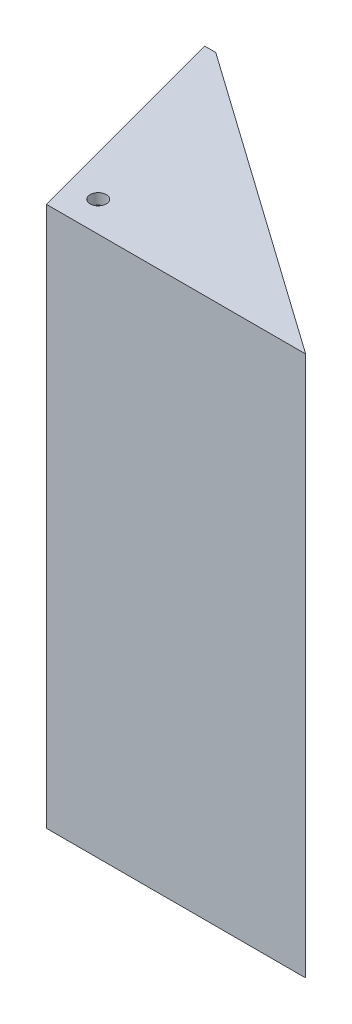
ISO-10303-21;
HEADER;
FILE_DESCRIPTION(('STEP AP214'),'2;1');
FILE_NAME('part.step','',(''),(''),'','','');
FILE_SCHEMA(('AUTOMOTIVE_DESIGN { 1 0 10303 214 1 1 1 1 }'));
ENDSEC;
DATA;
#1=APPLICATION_CONTEXT('core data for automotive mechanical design processes');
#2=APPLICATION_PROTOCOL_DEFINITION('international standard','automotive_design',2000,#1);
#3=PRODUCT_CONTEXT('',#1,'mechanical');
#4=PRODUCT('Part','Part','',(#3));
#5=PRODUCT_RELATED_PRODUCT_CATEGORY('part','',(#4));
#6=PRODUCT_DEFINITION_FORMATION('','',#4);
#7=PRODUCT_DEFINITION_CONTEXT('part definition',#1,'design');
#8=PRODUCT_DEFINITION('design','',#6,#7);
#9=PRODUCT_DEFINITION_SHAPE('','',#8);
#10=(LENGTH_UNIT() NAMED_UNIT(*) SI_UNIT(.MILLI.,.METRE.));
#11=(NAMED_UNIT(*) PLANE_ANGLE_UNIT() SI_UNIT($,.RADIAN.));
#12=(NAMED_UNIT(*) SI_UNIT($,.STERADIAN.) SOLID_ANGLE_UNIT());
#13=UNCERTAINTY_MEASURE_WITH_UNIT(LENGTH_MEASURE(1.E-05),#10,'distance_accuracy_value','');
#14=(GEOMETRIC_REPRESENTATION_CONTEXT(3) GLOBAL_UNCERTAINTY_ASSIGNED_CONTEXT((#13)) GLOBAL_UNIT_ASSIGNED_CONTEXT((#10,
#11,#12)) REPRESENTATION_CONTEXT('',''));
#15=CARTESIAN_POINT('',(0.,0.,0.));
#16=DIRECTION('',(0.,0.,1.));
#17=DIRECTION('',(1.,0.,0.));
#18=AXIS2_PLACEMENT_3D('',#15,#16,#17);
#19=CARTESIAN_POINT('',(0.,3.175,0.));
#20=DIRECTION('',(0.,-1.,0.));
#21=DIRECTION('',(0.,0.,-1.));
#22=AXIS2_PLACEMENT_3D('',#19,#20,#21);
#23=PLANE('',#22);
#24=CARTESIAN_POINT('',(6.35000000000001,3.17500000000001,-8.89));
#25=DIRECTION('',(0.,-1.,0.));
#26=DIRECTION('',(0.,0.,-1.));
#27=AXIS2_PLACEMENT_3D('',#24,#25,#26);
#28=CIRCLE('',#27,2.38125);
#29=CARTESIAN_POINT('',(6.35000000000001,3.17500000000001,-11.27125));
#30=VERTEX_POINT('',#29);
#31=EDGE_CURVE('E128',#30,#30,#28,.T.);
#32=ORIENTED_EDGE('',*,*,#31,.T.);
#33=EDGE_LOOP('',(#32));
#34=FACE_BOUND('',#33,.T.);
#35=DIRECTION('',(-0.965925826289068,0.,-0.258819045102522));
#36=VECTOR('',#35,1.);
#37=CARTESIAN_POINT('',(5.10443211581293,3.175,-19.0500000000001));
#38=LINE('',#37,#36);
#39=CARTESIAN_POINT('',(64.3507386859689,3.175,-3.17499999999999));
#40=VERTEX_POINT('',#39);
#41=CARTESIAN_POINT('',(76.2,3.17500000000001,0.));
#42=VERTEX_POINT('',#41);
#43=EDGE_CURVE('E49',#40,#42,#38,.F.);
#44=ORIENTED_EDGE('',*,*,#43,.T.);
#45=DIRECTION('',(-0.816875529536207,0.,-0.57681398149225));
#46=VECTOR('',#45,1.);
#47=CARTESIAN_POINT('',(25.3528349364646,3.175,-35.9043142650432));
#48=LINE('',#47,#46);
#49=CARTESIAN_POINT('',(-13.7277718465741,3.17500000000001,-63.5));
#50=VERTEX_POINT('',#49);
#51=EDGE_CURVE('E174',#42,#50,#48,.T.);
#52=ORIENTED_EDGE('',*,*,#51,.T.);
#53=DIRECTION('',(-0.258819045102518,0.,-0.965925826289069));
#54=VECTOR('',#53,1.);
#55=CARTESIAN_POINT('',(2.43626318683323,3.175,-3.17499999999999));
#56=LINE('',#55,#54);
#57=CARTESIAN_POINT('',(2.43626318683323,3.175,-3.17499999999999));
#58=VERTEX_POINT('',#57);
#59=EDGE_CURVE('E140',#58,#50,#56,.T.);
#60=ORIENTED_EDGE('',*,*,#59,.F.);
#61=DIRECTION('',(-1.,0.,0.));
#62=VECTOR('',#61,1.);
#63=CARTESIAN_POINT('',(76.2,3.175,-3.175));
#64=LINE('',#63,#62);
#65=EDGE_CURVE('E136',#40,#58,#64,.T.);
#66=ORIENTED_EDGE('',*,*,#65,.F.);
#67=EDGE_LOOP('',(#44,#52,#60,#66));
#68=FACE_BOUND('',#67,.T.);
#69=ADVANCED_FACE('F39',(#34,#68),#23,.F.);
#70=CARTESIAN_POINT('',(76.2,3.175,-63.5));
#71=DIRECTION('',(0.,0.,1.));
#72=DIRECTION('',(1.,0.,0.));
#73=AXIS2_PLACEMENT_3D('',#70,#71,#72);
#74=PLANE('',#73);
#75=DIRECTION('',(-1.,0.,0.));
#76=VECTOR('',#75,1.);
#77=CARTESIAN_POINT('',(76.2,158.75,-63.5));
#78=LINE('',#77,#76);
#79=CARTESIAN_POINT('',(-13.7277718465741,158.75,-63.5));
#80=VERTEX_POINT('',#79);
#81=CARTESIAN_POINT('',(-17.0147737193762,158.75,-63.5));
#82=VERTEX_POINT('',#81);
#83=EDGE_CURVE('E117',#80,#82,#78,.T.);
#84=ORIENTED_EDGE('',*,*,#83,.F.);
#85=DIRECTION('',(0.,1.,0.));
#86=VECTOR('',#85,1.);
#87=CARTESIAN_POINT('',(-13.7277718465741,-95.25,-63.5));
#88=LINE('',#87,#86);
#89=CARTESIAN_POINT('',(-13.7277718465741,155.575,-63.5));
#90=VERTEX_POINT('',#89);
#91=EDGE_CURVE('E102',#90,#80,#88,.T.);
#92=ORIENTED_EDGE('',*,*,#91,.F.);
#93=DIRECTION('',(0.,-1.,0.));
#94=VECTOR('',#93,1.);
#95=CARTESIAN_POINT('',(-13.7277718465741,155.575,-63.5));
#96=LINE('',#95,#94);
#97=EDGE_CURVE('E143',#90,#50,#96,.T.);
#98=ORIENTED_EDGE('',*,*,#97,.T.);
#99=CARTESIAN_POINT('',(-13.7277718465741,0.,-63.5));
#100=VERTEX_POINT('',#99);
#101=EDGE_CURVE('E111',#100,#50,#88,.T.);
#102=ORIENTED_EDGE('',*,*,#101,.F.);
#103=DIRECTION('',(-1.,0.,0.));
#104=VECTOR('',#103,1.);
#105=CARTESIAN_POINT('',(76.2,0.,-63.5));
#106=LINE('',#105,#104);
#107=CARTESIAN_POINT('',(-17.0147737193762,0.,-63.5));
#108=VERTEX_POINT('',#107);
#109=EDGE_CURVE('E151',#100,#108,#106,.T.);
#110=ORIENTED_EDGE('',*,*,#109,.T.);
#111=DIRECTION('',(0.,-1.,0.));
#112=VECTOR('',#111,1.);
#113=CARTESIAN_POINT('',(-17.0147737193762,3.175,-63.5));
#114=LINE('',#113,#112);
#115=EDGE_CURVE('E125',#82,#108,#114,.T.);
#116=ORIENTED_EDGE('',*,*,#115,.F.);
#117=EDGE_LOOP('',(#84,#92,#98,#102,#110,#116));
#118=FACE_BOUND('',#117,.T.);
#119=ADVANCED_FACE('F123',(#118),#74,.F.);
#120=CARTESIAN_POINT('',(-17.0147737193762,3.175,-63.5));
#121=DIRECTION('',(0.965925826289069,0.,-0.258819045102519));
#122=DIRECTION('',(-0.258819045102519,0.,-0.965925826289069));
#123=AXIS2_PLACEMENT_3D('',#120,#121,#122);
#124=PLANE('',#123);
#125=CARTESIAN_POINT('',(-15.8084857832013,38.1,-58.9980721336381));
#126=DIRECTION('',(0.965925826289069,0.,-0.258819045102519));
#127=DIRECTION('',(-0.258819045102519,0.,-0.965925826289069));
#128=AXIS2_PLACEMENT_3D('',#125,#126,#127);
#129=CIRCLE('',#128,1.58749999999999);
#130=CARTESIAN_POINT('',(-16.2193610173016,38.1,-60.531479382872));
#131=VERTEX_POINT('',#130);
#132=EDGE_CURVE('E121',#131,#131,#129,.T.);
#133=ORIENTED_EDGE('',*,*,#132,.T.);
#134=EDGE_LOOP('',(#133));
#135=FACE_BOUND('',#134,.T.);
#136=DIRECTION('',(0.258819045102519,0.,0.965925826289069));
#137=VECTOR('',#136,1.);
#138=CARTESIAN_POINT('',(-17.0147737193762,0.,-63.5));
#139=LINE('',#138,#137);
#140=CARTESIAN_POINT('',(0.,0.,0.));
#141=VERTEX_POINT('',#140);
#142=EDGE_CURVE('E153',#108,#141,#139,.T.);
#143=ORIENTED_EDGE('',*,*,#142,.T.);
#144=DIRECTION('',(0.,-1.,0.));
#145=VECTOR('',#144,1.);
#146=CARTESIAN_POINT('',(0.,3.175,0.));
#147=LINE('',#146,#145);
#148=CARTESIAN_POINT('',(0.,158.75,0.));
#149=VERTEX_POINT('',#148);
#150=EDGE_CURVE('E160',#149,#141,#147,.T.);
#151=ORIENTED_EDGE('',*,*,#150,.F.);
#152=DIRECTION('',(0.258819045102519,0.,0.965925826289069));
#153=VECTOR('',#152,1.);
#154=CARTESIAN_POINT('',(-17.0147737193762,158.75,-63.5));
#155=LINE('',#154,#153);
#156=EDGE_CURVE('E127',#82,#149,#155,.T.);
#157=ORIENTED_EDGE('',*,*,#156,.F.);
#158=ORIENTED_EDGE('',*,*,#115,.T.);
#159=EDGE_LOOP('',(#143,#151,#157,#158));
#160=FACE_BOUND('',#159,.T.);
#161=ADVANCED_FACE('F200',(#135,#160),#124,.F.);
#162=CARTESIAN_POINT('',(0.,3.175,0.));
#163=DIRECTION('',(0.,0.,-1.));
#164=DIRECTION('',(-1.,0.,0.));
#165=AXIS2_PLACEMENT_3D('',#162,#163,#164);
#166=PLANE('',#165);
#167=DIRECTION('',(1.,0.,0.));
#168=VECTOR('',#167,1.);
#169=CARTESIAN_POINT('',(0.,0.,0.));
#170=LINE('',#169,#168);
#171=CARTESIAN_POINT('',(76.2,0.,0.));
#172=VERTEX_POINT('',#171);
#173=EDGE_CURVE('E155',#141,#172,#170,.T.);
#174=ORIENTED_EDGE('',*,*,#173,.T.);
#175=DIRECTION('',(0.,-1.,0.));
#176=VECTOR('',#175,1.);
#177=CARTESIAN_POINT('',(76.2,3.175,0.));
#178=LINE('',#177,#176);
#179=EDGE_CURVE('E158',#42,#172,#178,.T.);
#180=ORIENTED_EDGE('',*,*,#179,.F.);
#181=CARTESIAN_POINT('',(76.2,155.575,0.));
#182=VERTEX_POINT('',#181);
#183=EDGE_CURVE('E161',#182,#42,#178,.T.);
#184=ORIENTED_EDGE('',*,*,#183,.F.);
#185=CARTESIAN_POINT('',(76.2,158.75,0.));
#186=VERTEX_POINT('',#185);
#187=EDGE_CURVE('E56',#186,#182,#178,.T.);
#188=ORIENTED_EDGE('',*,*,#187,.F.);
#189=DIRECTION('',(1.,0.,0.));
#190=VECTOR('',#189,1.);
#191=CARTESIAN_POINT('',(0.,158.75,0.));
#192=LINE('',#191,#190);
#193=EDGE_CURVE('E120',#149,#186,#192,.T.);
#194=ORIENTED_EDGE('',*,*,#193,.F.);
#195=ORIENTED_EDGE('',*,*,#150,.T.);
#196=EDGE_LOOP('',(#174,#180,#184,#188,#194,#195));
#197=FACE_BOUND('',#196,.T.);
#198=ADVANCED_FACE('F180',(#197),#166,.F.);
#199=CARTESIAN_POINT('',(0.,0.,0.));
#200=DIRECTION('',(0.,-1.,0.));
#201=DIRECTION('',(0.,0.,-1.));
#202=AXIS2_PLACEMENT_3D('',#199,#200,#201);
#203=PLANE('',#202);
#204=DIRECTION('',(-0.816875529536207,0.,-0.57681398149225));
#205=VECTOR('',#204,1.);
#206=CARTESIAN_POINT('',(25.3528349364646,0.,-35.9043142650432));
#207=LINE('',#206,#205);
#208=EDGE_CURVE('E198',#172,#100,#207,.T.);
#209=ORIENTED_EDGE('',*,*,#208,.F.);
#210=ORIENTED_EDGE('',*,*,#173,.F.);
#211=ORIENTED_EDGE('',*,*,#142,.F.);
#212=ORIENTED_EDGE('',*,*,#109,.F.);
#213=EDGE_LOOP('',(#209,#210,#211,#212));
#214=FACE_BOUND('',#213,.T.);
#215=CARTESIAN_POINT('',(6.35000000000001,0.,-8.89));
#216=DIRECTION('',(0.,-1.,0.));
#217=DIRECTION('',(0.,0.,-1.));
#218=AXIS2_PLACEMENT_3D('',#215,#216,#217);
#219=CIRCLE('',#218,2.38125);
#220=CARTESIAN_POINT('',(6.35000000000001,0.,-11.27125));
#221=VERTEX_POINT('',#220);
#222=EDGE_CURVE('E259',#221,#221,#219,.T.);
#223=ORIENTED_EDGE('',*,*,#222,.F.);
#224=EDGE_LOOP('',(#223));
#225=FACE_BOUND('',#224,.T.);
#226=ADVANCED_FACE('F196',(#214,#225),#203,.T.);
#227=CARTESIAN_POINT('',(76.2,155.575,-3.175));
#228=DIRECTION('',(0.,0.,1.));
#229=DIRECTION('',(1.,0.,0.));
#230=AXIS2_PLACEMENT_3D('',#227,#228,#229);
#231=PLANE('',#230);
#232=DIRECTION('',(-1.,0.,0.));
#233=VECTOR('',#232,1.);
#234=CARTESIAN_POINT('',(76.2,155.575,-3.175));
#235=LINE('',#234,#233);
#236=CARTESIAN_POINT('',(64.3507386859689,155.575,-3.17499999999999));
#237=VERTEX_POINT('',#236);
#238=CARTESIAN_POINT('',(2.43626318683323,155.575,-3.17499999999999));
#239=VERTEX_POINT('',#238);
#240=EDGE_CURVE('E137',#237,#239,#235,.T.);
#241=ORIENTED_EDGE('',*,*,#240,.F.);
#242=DIRECTION('',(0.,-1.,0.));
#243=VECTOR('',#242,1.);
#244=CARTESIAN_POINT('',(64.3507386859689,155.575,-3.17499999999999));
#245=LINE('',#244,#243);
#246=EDGE_CURVE('E165',#237,#40,#245,.T.);
#247=ORIENTED_EDGE('',*,*,#246,.T.);
#248=ORIENTED_EDGE('',*,*,#65,.T.);
#249=DIRECTION('',(0.,-1.,0.));
#250=VECTOR('',#249,1.);
#251=CARTESIAN_POINT('',(2.43626318683323,155.575,-3.17499999999999));
#252=LINE('',#251,#250);
#253=EDGE_CURVE('E148',#239,#58,#252,.T.);
#254=ORIENTED_EDGE('',*,*,#253,.F.);
#255=EDGE_LOOP('',(#241,#247,#248,#254));
#256=FACE_BOUND('',#255,.T.);
#257=ADVANCED_FACE('F185',(#256),#231,.F.);
#258=CARTESIAN_POINT('',(2.43626318683323,155.575,-3.17499999999999));
#259=DIRECTION('',(-0.965925826289069,0.,0.258819045102518));
#260=DIRECTION('',(0.258819045102518,0.,0.965925826289069));
#261=AXIS2_PLACEMENT_3D('',#258,#259,#260);
#262=PLANE('',#261);
#263=CARTESIAN_POINT('',(-12.7416712847335,38.1,-59.8198226018387));
#264=DIRECTION('',(0.965925826289069,0.,-0.258819045102518));
#265=DIRECTION('',(-0.258819045102518,0.,-0.965925826289069));
#266=AXIS2_PLACEMENT_3D('',#263,#264,#265);
#267=CIRCLE('',#266,1.58749999999999);
#268=CARTESIAN_POINT('',(-13.1525465188337,38.1,-61.3532298510725));
#269=VERTEX_POINT('',#268);
#270=EDGE_CURVE('E251',#269,#269,#267,.T.);
#271=ORIENTED_EDGE('',*,*,#270,.F.);
#272=EDGE_LOOP('',(#271));
#273=FACE_BOUND('',#272,.T.);
#274=ORIENTED_EDGE('',*,*,#59,.T.);
#275=ORIENTED_EDGE('',*,*,#97,.F.);
#276=DIRECTION('',(-0.258819045102518,0.,-0.965925826289069));
#277=VECTOR('',#276,1.);
#278=CARTESIAN_POINT('',(2.43626318683323,155.575,-3.17499999999999));
#279=LINE('',#278,#277);
#280=EDGE_CURVE('E139',#239,#90,#279,.T.);
#281=ORIENTED_EDGE('',*,*,#280,.F.);
#282=ORIENTED_EDGE('',*,*,#253,.T.);
#283=EDGE_LOOP('',(#274,#275,#281,#282));
#284=FACE_BOUND('',#283,.T.);
#285=ADVANCED_FACE('F191',(#273,#284),#262,.F.);
#286=CARTESIAN_POINT('',(0.,158.75,0.));
#287=DIRECTION('',(0.,-1.,0.));
#288=DIRECTION('',(0.,0.,-1.));
#289=AXIS2_PLACEMENT_3D('',#286,#287,#288);
#290=PLANE('',#289);
#291=CARTESIAN_POINT('',(6.35000000000001,158.75,-8.89));
#292=DIRECTION('',(0.,-1.,0.));
#293=DIRECTION('',(0.,0.,-1.));
#294=AXIS2_PLACEMENT_3D('',#291,#292,#293);
#295=CIRCLE('',#294,2.38125);
#296=CARTESIAN_POINT('',(6.35000000000001,158.75,-11.27125));
#297=VERTEX_POINT('',#296);
#298=EDGE_CURVE('E260',#297,#297,#295,.T.);
#299=ORIENTED_EDGE('',*,*,#298,.T.);
#300=EDGE_LOOP('',(#299));
#301=FACE_BOUND('',#300,.T.);
#302=ORIENTED_EDGE('',*,*,#193,.T.);
#303=DIRECTION('',(0.816875529536207,0.,0.57681398149225));
#304=VECTOR('',#303,1.);
#305=CARTESIAN_POINT('',(-13.7277718465741,158.75,-63.5));
#306=LINE('',#305,#304);
#307=EDGE_CURVE('E105',#80,#186,#306,.T.);
#308=ORIENTED_EDGE('',*,*,#307,.F.);
#309=ORIENTED_EDGE('',*,*,#83,.T.);
#310=ORIENTED_EDGE('',*,*,#156,.T.);
#311=EDGE_LOOP('',(#302,#308,#309,#310));
#312=FACE_BOUND('',#311,.T.);
#313=ADVANCED_FACE('F115',(#301,#312),#290,.F.);
#314=CARTESIAN_POINT('',(0.,155.575,0.));
#315=DIRECTION('',(0.,-1.,0.));
#316=DIRECTION('',(0.,0.,-1.));
#317=AXIS2_PLACEMENT_3D('',#314,#315,#316);
#318=PLANE('',#317);
#319=DIRECTION('',(-0.816875529536207,0.,-0.57681398149225));
#320=VECTOR('',#319,1.);
#321=CARTESIAN_POINT('',(25.3528349364646,155.575,-35.9043142650432));
#322=LINE('',#321,#320);
#323=EDGE_CURVE('E106',#182,#90,#322,.T.);
#324=ORIENTED_EDGE('',*,*,#323,.F.);
#325=DIRECTION('',(0.965925826289068,0.,0.258819045102522));
#326=VECTOR('',#325,1.);
#327=CARTESIAN_POINT('',(64.3507386859689,155.575,-3.17499999999999));
#328=LINE('',#327,#326);
#329=EDGE_CURVE('E11',#182,#237,#328,.F.);
#330=ORIENTED_EDGE('',*,*,#329,.T.);
#331=ORIENTED_EDGE('',*,*,#240,.T.);
#332=ORIENTED_EDGE('',*,*,#280,.T.);
#333=EDGE_LOOP('',(#324,#330,#331,#332));
#334=FACE_BOUND('',#333,.T.);
#335=CARTESIAN_POINT('',(6.35000000000001,155.575,-8.89));
#336=DIRECTION('',(0.,-1.,0.));
#337=DIRECTION('',(0.,0.,-1.));
#338=AXIS2_PLACEMENT_3D('',#335,#336,#337);
#339=CIRCLE('',#338,2.38125);
#340=CARTESIAN_POINT('',(6.35000000000001,155.575,-11.27125));
#341=VERTEX_POINT('',#340);
#342=EDGE_CURVE('E44',#341,#341,#339,.T.);
#343=ORIENTED_EDGE('',*,*,#342,.F.);
#344=EDGE_LOOP('',(#343));
#345=FACE_BOUND('',#344,.T.);
#346=ADVANCED_FACE('F188',(#334,#345),#318,.T.);
#347=CARTESIAN_POINT('',(64.3507386859689,155.575,-3.17499999999999));
#348=DIRECTION('',(-0.258819045102522,0.,0.965925826289068));
#349=DIRECTION('',(0.,-1.,0.));
#350=AXIS2_PLACEMENT_3D('',#347,#348,#349);
#351=PLANE('',#350);
#352=ORIENTED_EDGE('',*,*,#329,.F.);
#353=ORIENTED_EDGE('',*,*,#183,.T.);
#354=ORIENTED_EDGE('',*,*,#43,.F.);
#355=ORIENTED_EDGE('',*,*,#246,.F.);
#356=EDGE_LOOP('',(#352,#353,#354,#355));
#357=FACE_BOUND('',#356,.T.);
#358=ADVANCED_FACE('F42',(#357),#351,.F.);
#359=CARTESIAN_POINT('',(6.35000000000001,158.75,-8.89));
#360=DIRECTION('',(0.,-1.,0.));
#361=DIRECTION('',(0.,0.,-1.));
#362=AXIS2_PLACEMENT_3D('',#359,#360,#361);
#363=CYLINDRICAL_SURFACE('',#362,2.38125);
#364=CARTESIAN_POINT('',(6.35000000000001,155.575,-11.27125));
#365=CARTESIAN_POINT('',(6.35000000000001,155.608072916667,-11.27125));
#366=CARTESIAN_POINT('',(6.35000000000001,155.641145833333,-11.27125));
#367=CARTESIAN_POINT('',(6.35000000000001,155.707291666667,-11.27125));
#368=CARTESIAN_POINT('',(6.35000000000001,155.740364583333,-11.27125));
#369=CARTESIAN_POINT('',(6.35000000000001,155.806510416667,-11.27125));
#370=CARTESIAN_POINT('',(6.35000000000001,155.839583333333,-11.27125));
#371=CARTESIAN_POINT('',(6.35000000000001,155.905729166667,-11.27125));
#372=CARTESIAN_POINT('',(6.35000000000001,155.938802083333,-11.27125));
#373=CARTESIAN_POINT('',(6.35000000000001,156.004947916667,-11.27125));
#374=CARTESIAN_POINT('',(6.35000000000001,156.038020833333,-11.27125));
#375=CARTESIAN_POINT('',(6.35000000000001,156.104166666667,-11.27125));
#376=CARTESIAN_POINT('',(6.35000000000001,156.137239583333,-11.27125));
#377=CARTESIAN_POINT('',(6.35000000000001,156.203385416667,-11.27125));
#378=CARTESIAN_POINT('',(6.35000000000001,156.236458333333,-11.27125));
#379=CARTESIAN_POINT('',(6.35000000000001,156.302604166667,-11.27125));
#380=CARTESIAN_POINT('',(6.35000000000001,156.335677083333,-11.27125));
#381=CARTESIAN_POINT('',(6.35000000000001,156.401822916667,-11.27125));
#382=CARTESIAN_POINT('',(6.35000000000001,156.434895833333,-11.27125));
#383=CARTESIAN_POINT('',(6.35000000000001,156.501041666667,-11.27125));
#384=CARTESIAN_POINT('',(6.35000000000001,156.534114583333,-11.27125));
#385=CARTESIAN_POINT('',(6.35000000000001,156.600260416667,-11.27125));
#386=CARTESIAN_POINT('',(6.35000000000001,156.633333333333,-11.27125));
#387=CARTESIAN_POINT('',(6.35000000000001,156.699479166667,-11.27125));
#388=CARTESIAN_POINT('',(6.35000000000001,156.732552083333,-11.27125));
#389=CARTESIAN_POINT('',(6.35000000000001,156.798697916667,-11.27125));
#390=CARTESIAN_POINT('',(6.35000000000001,156.831770833333,-11.27125));
#391=CARTESIAN_POINT('',(6.35000000000001,156.897916666667,-11.27125));
#392=CARTESIAN_POINT('',(6.35000000000001,156.930989583333,-11.27125));
#393=CARTESIAN_POINT('',(6.35000000000001,156.997135416667,-11.27125));
#394=CARTESIAN_POINT('',(6.35000000000001,157.030208333333,-11.27125));
#395=CARTESIAN_POINT('',(6.35000000000001,157.096354166667,-11.27125));
#396=CARTESIAN_POINT('',(6.35000000000001,157.129427083333,-11.27125));
#397=CARTESIAN_POINT('',(6.35000000000001,157.195572916667,-11.27125));
#398=CARTESIAN_POINT('',(6.35000000000001,157.228645833333,-11.27125));
#399=CARTESIAN_POINT('',(6.35000000000001,157.294791666667,-11.27125));
#400=CARTESIAN_POINT('',(6.35000000000001,157.327864583333,-11.27125));
#401=CARTESIAN_POINT('',(6.35000000000001,157.394010416667,-11.27125));
#402=CARTESIAN_POINT('',(6.35000000000001,157.427083333333,-11.27125));
#403=CARTESIAN_POINT('',(6.35000000000001,157.493229166667,-11.27125));
#404=CARTESIAN_POINT('',(6.35000000000001,157.526302083333,-11.27125));
#405=CARTESIAN_POINT('',(6.35000000000001,157.592447916667,-11.27125));
#406=CARTESIAN_POINT('',(6.35000000000001,157.625520833333,-11.27125));
#407=CARTESIAN_POINT('',(6.35000000000001,157.691666666667,-11.27125));
#408=CARTESIAN_POINT('',(6.35000000000001,157.724739583333,-11.27125));
#409=CARTESIAN_POINT('',(6.35000000000001,157.790885416667,-11.27125));
#410=CARTESIAN_POINT('',(6.35000000000001,157.823958333333,-11.27125));
#411=CARTESIAN_POINT('',(6.35000000000001,157.890104166667,-11.27125));
#412=CARTESIAN_POINT('',(6.35000000000001,157.923177083333,-11.27125));
#413=CARTESIAN_POINT('',(6.35000000000001,157.989322916667,-11.27125));
#414=CARTESIAN_POINT('',(6.35000000000001,158.022395833333,-11.27125));
#415=CARTESIAN_POINT('',(6.35000000000001,158.088541666667,-11.27125));
#416=CARTESIAN_POINT('',(6.35000000000001,158.121614583333,-11.27125));
#417=CARTESIAN_POINT('',(6.35000000000001,158.187760416667,-11.27125));
#418=CARTESIAN_POINT('',(6.35000000000001,158.220833333333,-11.27125));
#419=CARTESIAN_POINT('',(6.35000000000001,158.286979166667,-11.27125));
#420=CARTESIAN_POINT('',(6.35000000000001,158.320052083333,-11.27125));
#421=CARTESIAN_POINT('',(6.35000000000001,158.386197916667,-11.27125));
#422=CARTESIAN_POINT('',(6.35000000000001,158.419270833333,-11.27125));
#423=CARTESIAN_POINT('',(6.35000000000001,158.485416666667,-11.27125));
#424=CARTESIAN_POINT('',(6.35000000000001,158.518489583333,-11.27125));
#425=CARTESIAN_POINT('',(6.35000000000001,158.584635416667,-11.27125));
#426=CARTESIAN_POINT('',(6.35000000000001,158.617708333333,-11.27125));
#427=CARTESIAN_POINT('',(6.35000000000001,158.683854166667,-11.27125));
#428=CARTESIAN_POINT('',(6.35000000000001,158.716927083333,-11.27125));
#429=CARTESIAN_POINT('',(6.35000000000001,158.75,-11.27125));
#430=B_SPLINE_CURVE_WITH_KNOTS('',3,(#364,#365,#366,#367,#368,#369,#370,#371,#372,#373,#374,
#375,#376,#377,#378,#379,#380,#381,#382,#383,#384,#385,#386,#387,#388,#389,#390,#391,#392,#393,
#394,#395,#396,#397,#398,#399,#400,#401,#402,#403,#404,#405,#406,#407,#408,#409,#410,#411,#412,
#413,#414,#415,#416,#417,#418,#419,#420,#421,#422,#423,#424,#425,#426,#427,#428,#429),
.UNSPECIFIED.,.F.,.F.,(4,2,2,2,2,2,2,2,2,2,2,2,2,2,2,2,2,2,2,2,2,2,2,2,2,2,2,2,2,2,2,2,4),(0.,
0.0992187499999908,0.198437499999982,0.297656249999972,0.396874999999991,0.496093749999982,
0.595312499999973,0.694531249999991,0.793749999999982,0.892968749999973,0.992187499999991,
1.09140624999998,1.19062499999997,1.28984374999999,1.38906249999998,1.48828124999997,
1.58749999999999,1.68671874999998,1.78593749999997,1.88515624999996,1.98437499999998,
2.08359374999997,2.18281249999996,2.28203124999998,2.38124999999997,2.48046874999996,
2.57968749999998,2.67890624999997,2.77812499999996,2.87734374999998,2.97656249999997,
3.07578124999996,3.17499999999996),.UNSPECIFIED.);
#431=EDGE_CURVE('BSEAM235',#341,#297,#430,.T.);
#432=ORIENTED_EDGE('',*,*,#342,.T.);
#433=ORIENTED_EDGE('',*,*,#298,.F.);
#434=ORIENTED_EDGE('',*,*,#431,.T.);
#435=ORIENTED_EDGE('',*,*,#431,.F.);
#436=EDGE_LOOP('',(#432,#434,#433,#435));
#437=FACE_BOUND('',#436,.T.);
#438=ADVANCED_FACE('F235',(#437),#363,.F.);
#439=CARTESIAN_POINT('',(6.35000000000001,0.,-11.27125));
#440=CARTESIAN_POINT('',(6.35000000000001,0.0330729166666914,-11.27125));
#441=CARTESIAN_POINT('',(6.35000000000001,0.066145833333355,-11.27125));
#442=CARTESIAN_POINT('',(6.35000000000001,0.132291666666691,-11.27125));
#443=CARTESIAN_POINT('',(6.35000000000001,0.165364583333364,-11.27125));
#444=CARTESIAN_POINT('',(6.35000000000001,0.231510416666701,-11.27125));
#445=CARTESIAN_POINT('',(6.35000000000001,0.264583333333364,-11.27125));
#446=CARTESIAN_POINT('',(6.35000000000001,0.330729166666692,-11.27125));
#447=CARTESIAN_POINT('',(6.35000000000001,0.363802083333355,-11.27125));
#448=CARTESIAN_POINT('',(6.35000000000001,0.429947916666692,-11.27125));
#449=CARTESIAN_POINT('',(6.35000000000001,0.463020833333364,-11.27125));
#450=CARTESIAN_POINT('',(6.35000000000001,0.529166666666701,-11.27125));
#451=CARTESIAN_POINT('',(6.35000000000001,0.562239583333365,-11.27125));
#452=CARTESIAN_POINT('',(6.35000000000001,0.628385416666692,-11.27125));
#453=CARTESIAN_POINT('',(6.35000000000001,0.661458333333355,-11.27125));
#454=CARTESIAN_POINT('',(6.35000000000001,0.727604166666682,-11.27125));
#455=CARTESIAN_POINT('',(6.35000000000001,0.760677083333346,-11.27125));
#456=CARTESIAN_POINT('',(6.35000000000001,0.826822916666683,-11.27125));
#457=CARTESIAN_POINT('',(6.35000000000001,0.859895833333355,-11.27125));
#458=CARTESIAN_POINT('',(6.35000000000001,0.926041666666692,-11.27125));
#459=CARTESIAN_POINT('',(6.35000000000001,0.959114583333356,-11.27125));
#460=CARTESIAN_POINT('',(6.35000000000001,1.02526041666668,-11.27125));
#461=CARTESIAN_POINT('',(6.35000000000001,1.05833333333335,-11.27125));
#462=CARTESIAN_POINT('',(6.35000000000001,1.12447916666668,-11.27125));
#463=CARTESIAN_POINT('',(6.35000000000001,1.15755208333336,-11.27125));
#464=CARTESIAN_POINT('',(6.35000000000001,1.22369791666669,-11.27125));
#465=CARTESIAN_POINT('',(6.35000000000001,1.25677083333336,-11.27125));
#466=CARTESIAN_POINT('',(6.35000000000001,1.32291666666668,-11.27125));
#467=CARTESIAN_POINT('',(6.35000000000001,1.35598958333335,-11.27125));
#468=CARTESIAN_POINT('',(6.35000000000001,1.42213541666668,-11.27125));
#469=CARTESIAN_POINT('',(6.35000000000001,1.45520833333336,-11.27125));
#470=CARTESIAN_POINT('',(6.35000000000001,1.52135416666669,-11.27125));
#471=CARTESIAN_POINT('',(6.35000000000001,1.55442708333336,-11.27125));
#472=CARTESIAN_POINT('',(6.35000000000001,1.62057291666668,-11.27125));
#473=CARTESIAN_POINT('',(6.35000000000001,1.65364583333335,-11.27125));
#474=CARTESIAN_POINT('',(6.35000000000001,1.71979166666668,-11.27125));
#475=CARTESIAN_POINT('',(6.35000000000001,1.75286458333336,-11.27125));
#476=CARTESIAN_POINT('',(6.35000000000001,1.81901041666669,-11.27125));
#477=CARTESIAN_POINT('',(6.35000000000001,1.85208333333336,-11.27125));
#478=CARTESIAN_POINT('',(6.35000000000001,1.91822916666668,-11.27125));
#479=CARTESIAN_POINT('',(6.35000000000001,1.95130208333335,-11.27125));
#480=CARTESIAN_POINT('',(6.35000000000001,2.01744791666668,-11.27125));
#481=CARTESIAN_POINT('',(6.35000000000001,2.05052083333336,-11.27125));
#482=CARTESIAN_POINT('',(6.35000000000001,2.11666666666669,-11.27125));
#483=CARTESIAN_POINT('',(6.35000000000001,2.14973958333336,-11.27125));
#484=CARTESIAN_POINT('',(6.35000000000001,2.21588541666668,-11.27125));
#485=CARTESIAN_POINT('',(6.35000000000001,2.24895833333335,-11.27125));
#486=CARTESIAN_POINT('',(6.35000000000001,2.31510416666668,-11.27125));
#487=CARTESIAN_POINT('',(6.35000000000001,2.34817708333336,-11.27125));
#488=CARTESIAN_POINT('',(6.35000000000001,2.41432291666669,-11.27125));
#489=CARTESIAN_POINT('',(6.35000000000001,2.44739583333336,-11.27125));
#490=CARTESIAN_POINT('',(6.35000000000001,2.51354166666668,-11.27125));
#491=CARTESIAN_POINT('',(6.35000000000001,2.54661458333335,-11.27125));
#492=CARTESIAN_POINT('',(6.35000000000001,2.61276041666667,-11.27125));
#493=CARTESIAN_POINT('',(6.35000000000001,2.64583333333334,-11.27125));
#494=CARTESIAN_POINT('',(6.35000000000001,2.71197916666667,-11.27125));
#495=CARTESIAN_POINT('',(6.35000000000001,2.74505208333335,-11.27125));
#496=CARTESIAN_POINT('',(6.35000000000001,2.81119791666668,-11.27125));
#497=CARTESIAN_POINT('',(6.35000000000001,2.84427083333335,-11.27125));
#498=CARTESIAN_POINT('',(6.35000000000001,2.91041666666667,-11.27125));
#499=CARTESIAN_POINT('',(6.35000000000001,2.94348958333334,-11.27125));
#500=CARTESIAN_POINT('',(6.35000000000001,3.00963541666667,-11.27125));
#501=CARTESIAN_POINT('',(6.35000000000001,3.04270833333335,-11.27125));
#502=CARTESIAN_POINT('',(6.35000000000001,3.10885416666668,-11.27125));
#503=CARTESIAN_POINT('',(6.35000000000001,3.14192708333335,-11.27125));
#504=CARTESIAN_POINT('',(6.35000000000001,3.17500000000001,-11.27125));
#505=B_SPLINE_CURVE_WITH_KNOTS('',3,(#439,#440,#441,#442,#443,#444,#445,#446,#447,#448,#449,
#450,#451,#452,#453,#454,#455,#456,#457,#458,#459,#460,#461,#462,#463,#464,#465,#466,#467,#468,
#469,#470,#471,#472,#473,#474,#475,#476,#477,#478,#479,#480,#481,#482,#483,#484,#485,#486,#487,
#488,#489,#490,#491,#492,#493,#494,#495,#496,#497,#498,#499,#500,#501,#502,#503,#504),
.UNSPECIFIED.,.F.,.F.,(4,2,2,2,2,2,2,2,2,2,2,2,2,2,2,2,2,2,2,2,2,2,2,2,2,2,2,2,2,2,2,2,4),(0.,
0.0992187499999908,0.198437500000009,0.29765625,0.396874999999991,0.49609375000001,0.5953125,
0.694531249999991,0.793749999999982,0.892968750000001,0.992187499999991,1.09140624999998,
1.190625,1.28984374999999,1.38906249999998,1.48828125,1.58749999999999,1.68671874999998,
1.7859375,1.88515624999999,1.98437499999998,2.08359375,2.18281249999999,2.28203124999998,
2.38125,2.48046874999999,2.57968749999998,2.67890624999997,2.77812499999999,2.87734374999998,
2.97656249999997,3.07578124999999,3.17499999999998),.UNSPECIFIED.);
#506=EDGE_CURVE('BSEAM238',#221,#30,#505,.T.);
#507=ORIENTED_EDGE('',*,*,#222,.T.);
#508=ORIENTED_EDGE('',*,*,#31,.F.);
#509=ORIENTED_EDGE('',*,*,#506,.T.);
#510=ORIENTED_EDGE('',*,*,#506,.F.);
#511=EDGE_LOOP('',(#507,#509,#508,#510));
#512=FACE_BOUND('',#511,.T.);
#513=ADVANCED_FACE('F238',(#512),#363,.F.);
#514=CARTESIAN_POINT('',(-13.7277718465741,-95.25,-63.5));
#515=DIRECTION('',(-0.57681398149225,0.,0.816875529536207));
#516=DIRECTION('',(0.816875529536207,0.,0.57681398149225));
#517=AXIS2_PLACEMENT_3D('',#514,#515,#516);
#518=PLANE('',#517);
#519=ORIENTED_EDGE('',*,*,#323,.T.);
#520=ORIENTED_EDGE('',*,*,#91,.T.);
#521=ORIENTED_EDGE('',*,*,#307,.T.);
#522=ORIENTED_EDGE('',*,*,#187,.T.);
#523=EDGE_LOOP('',(#519,#520,#521,#522));
#524=FACE_BOUND('',#523,.T.);
#525=ADVANCED_FACE('F104',(#524),#518,.F.);
#526=ORIENTED_EDGE('',*,*,#179,.T.);
#527=ORIENTED_EDGE('',*,*,#208,.T.);
#528=ORIENTED_EDGE('',*,*,#101,.T.);
#529=ORIENTED_EDGE('',*,*,#51,.F.);
#530=EDGE_LOOP('',(#526,#527,#528,#529));
#531=FACE_BOUND('',#530,.T.);
#532=ADVANCED_FACE('F242',(#531),#518,.F.);
#533=CARTESIAN_POINT('',(-20.1020260810562,38.1,-57.8476214781575));
#534=DIRECTION('',(0.965925826289069,0.,-0.258819045102518));
#535=DIRECTION('',(-0.258819045102518,0.,-0.965925826289069));
#536=AXIS2_PLACEMENT_3D('',#533,#534,#535);
#537=CYLINDRICAL_SURFACE('',#536,1.58749999999999);
#538=ORIENTED_EDGE('',*,*,#270,.T.);
#539=EDGE_LOOP('',(#538));
#540=FACE_BOUND('',#539,.T.);
#541=ORIENTED_EDGE('',*,*,#132,.F.);
#542=EDGE_LOOP('',(#541));
#543=FACE_BOUND('',#542,.T.);
#544=ADVANCED_FACE('F243',(#540,#543),#537,.F.);
#545=CLOSED_SHELL('',(#69,#119,#161,#198,#226,#257,#285,#313,#346,#358,#438,#513,#525,#532,#544));
#546=MANIFOLD_SOLID_BREP('B2',#545);
#547=ADVANCED_BREP_SHAPE_REPRESENTATION('',(#18,#546),#14);
#548=SHAPE_DEFINITION_REPRESENTATION(#9,#547);
ENDSEC;
END-ISO-10303-21;
